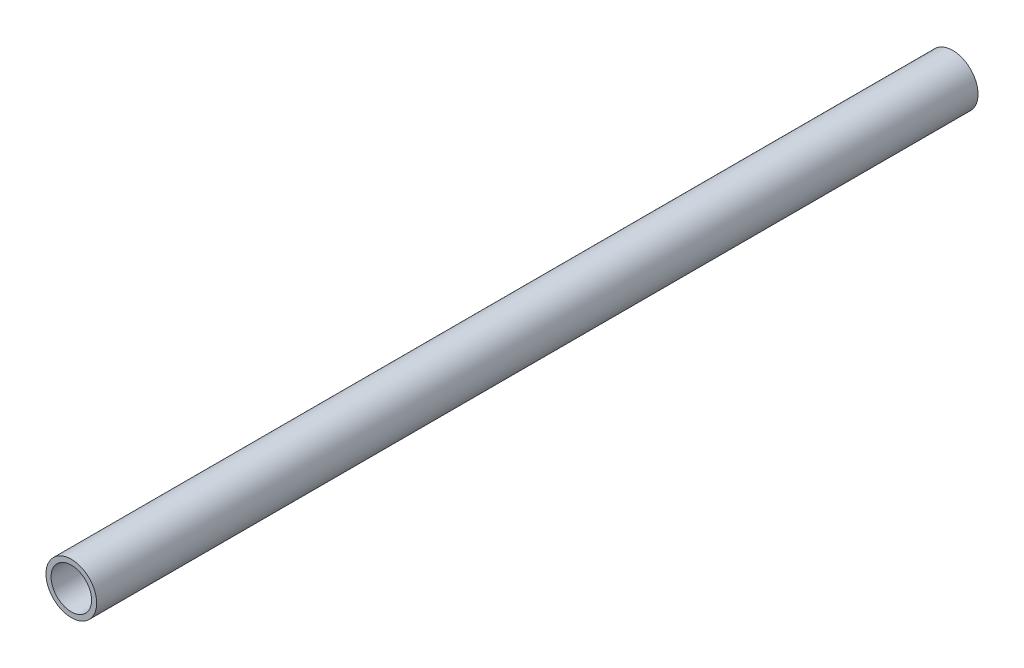
ISO-10303-21;
HEADER;
FILE_DESCRIPTION(('STEP AP214'),'2;1');
FILE_NAME('part.step','',(''),(''),'','','');
FILE_SCHEMA(('AUTOMOTIVE_DESIGN { 1 0 10303 214 1 1 1 1 }'));
ENDSEC;
DATA;
#1=APPLICATION_CONTEXT('core data for automotive mechanical design processes');
#2=APPLICATION_PROTOCOL_DEFINITION('international standard','automotive_design',2000,#1);
#3=PRODUCT_CONTEXT('',#1,'mechanical');
#4=PRODUCT('Part','Part','',(#3));
#5=PRODUCT_RELATED_PRODUCT_CATEGORY('part','',(#4));
#6=PRODUCT_DEFINITION_FORMATION('','',#4);
#7=PRODUCT_DEFINITION_CONTEXT('part definition',#1,'design');
#8=PRODUCT_DEFINITION('design','',#6,#7);
#9=PRODUCT_DEFINITION_SHAPE('','',#8);
#10=(LENGTH_UNIT() NAMED_UNIT(*) SI_UNIT(.MILLI.,.METRE.));
#11=(NAMED_UNIT(*) PLANE_ANGLE_UNIT() SI_UNIT($,.RADIAN.));
#12=(NAMED_UNIT(*) SI_UNIT($,.STERADIAN.) SOLID_ANGLE_UNIT());
#13=UNCERTAINTY_MEASURE_WITH_UNIT(LENGTH_MEASURE(1.E-05),#10,'distance_accuracy_value','');
#14=(GEOMETRIC_REPRESENTATION_CONTEXT(3) GLOBAL_UNCERTAINTY_ASSIGNED_CONTEXT((#13)) GLOBAL_UNIT_ASSIGNED_CONTEXT((#10,
#11,#12)) REPRESENTATION_CONTEXT('',''));
#15=CARTESIAN_POINT('',(0.,0.,0.));
#16=DIRECTION('',(0.,0.,1.));
#17=DIRECTION('',(1.,0.,0.));
#18=AXIS2_PLACEMENT_3D('',#15,#16,#17);
#19=CARTESIAN_POINT('',(0.,0.,552.577));
#20=DIRECTION('',(0.,0.,-1.));
#21=DIRECTION('',(-1.,0.,0.));
#22=AXIS2_PLACEMENT_3D('',#19,#20,#21);
#23=CYLINDRICAL_SURFACE('',#22,12.7);
#24=CARTESIAN_POINT('',(0.,0.,0.));
#25=DIRECTION('',(0.,0.,-1.));
#26=DIRECTION('',(-1.,0.,0.));
#27=AXIS2_PLACEMENT_3D('',#24,#25,#26);
#28=CIRCLE('',#27,12.7);
#29=CARTESIAN_POINT('',(-12.7,0.,0.));
#30=VERTEX_POINT('',#29);
#31=EDGE_CURVE('E27',#30,#30,#28,.T.);
#32=ORIENTED_EDGE('',*,*,#31,.T.);
#33=EDGE_LOOP('',(#32));
#34=FACE_BOUND('',#33,.T.);
#35=CARTESIAN_POINT('',(0.,0.,552.577));
#36=DIRECTION('',(0.,0.,-1.));
#37=DIRECTION('',(-1.,0.,0.));
#38=AXIS2_PLACEMENT_3D('',#35,#36,#37);
#39=CIRCLE('',#38,12.7);
#40=CARTESIAN_POINT('',(-12.7,0.,552.577));
#41=VERTEX_POINT('',#40);
#42=EDGE_CURVE('E18',#41,#41,#39,.T.);
#43=ORIENTED_EDGE('',*,*,#42,.F.);
#44=EDGE_LOOP('',(#43));
#45=FACE_BOUND('',#44,.T.);
#46=ADVANCED_FACE('F15',(#34,#45),#23,.F.);
#47=CARTESIAN_POINT('',(0.,0.,552.577));
#48=DIRECTION('',(0.,0.,1.));
#49=DIRECTION('',(1.,0.,0.));
#50=AXIS2_PLACEMENT_3D('',#47,#48,#49);
#51=PLANE('',#50);
#52=ORIENTED_EDGE('',*,*,#42,.T.);
#53=EDGE_LOOP('',(#52));
#54=FACE_BOUND('',#53,.T.);
#55=CARTESIAN_POINT('',(0.,0.,552.577));
#56=DIRECTION('',(0.,0.,-1.));
#57=DIRECTION('',(-1.,0.,0.));
#58=AXIS2_PLACEMENT_3D('',#55,#56,#57);
#59=CIRCLE('',#58,15.875);
#60=CARTESIAN_POINT('',(-15.875,0.,552.577));
#61=VERTEX_POINT('',#60);
#62=EDGE_CURVE('E22',#61,#61,#59,.T.);
#63=ORIENTED_EDGE('',*,*,#62,.F.);
#64=EDGE_LOOP('',(#63));
#65=FACE_BOUND('',#64,.T.);
#66=ADVANCED_FACE('F35',(#54,#65),#51,.T.);
#67=CARTESIAN_POINT('',(0.,0.,0.));
#68=DIRECTION('',(0.,0.,1.));
#69=DIRECTION('',(1.,0.,0.));
#70=AXIS2_PLACEMENT_3D('',#67,#68,#69);
#71=PLANE('',#70);
#72=ORIENTED_EDGE('',*,*,#31,.F.);
#73=EDGE_LOOP('',(#72));
#74=FACE_BOUND('',#73,.T.);
#75=CARTESIAN_POINT('',(0.,0.,0.));
#76=DIRECTION('',(0.,0.,-1.));
#77=DIRECTION('',(-1.,0.,0.));
#78=AXIS2_PLACEMENT_3D('',#75,#76,#77);
#79=CIRCLE('',#78,15.875);
#80=CARTESIAN_POINT('',(-15.875,0.,0.));
#81=VERTEX_POINT('',#80);
#82=EDGE_CURVE('E10',#81,#81,#79,.F.);
#83=ORIENTED_EDGE('',*,*,#82,.F.);
#84=EDGE_LOOP('',(#83));
#85=FACE_BOUND('',#84,.T.);
#86=ADVANCED_FACE('F43',(#74,#85),#71,.F.);
#87=CARTESIAN_POINT('',(0.,0.,552.577));
#88=DIRECTION('',(0.,0.,-1.));
#89=DIRECTION('',(-1.,0.,0.));
#90=AXIS2_PLACEMENT_3D('',#87,#88,#89);
#91=CYLINDRICAL_SURFACE('',#90,15.875);
#92=ORIENTED_EDGE('',*,*,#82,.T.);
#93=EDGE_LOOP('',(#92));
#94=FACE_BOUND('',#93,.T.);
#95=ORIENTED_EDGE('',*,*,#62,.T.);
#96=EDGE_LOOP('',(#95));
#97=FACE_BOUND('',#96,.T.);
#98=ADVANCED_FACE('F44',(#94,#97),#91,.T.);
#99=CLOSED_SHELL('',(#46,#66,#86,#98));
#100=MANIFOLD_SOLID_BREP('B1',#99);
#101=ADVANCED_BREP_SHAPE_REPRESENTATION('',(#18,#100),#14);
#102=SHAPE_DEFINITION_REPRESENTATION(#9,#101);
ENDSEC;
END-ISO-10303-21;
